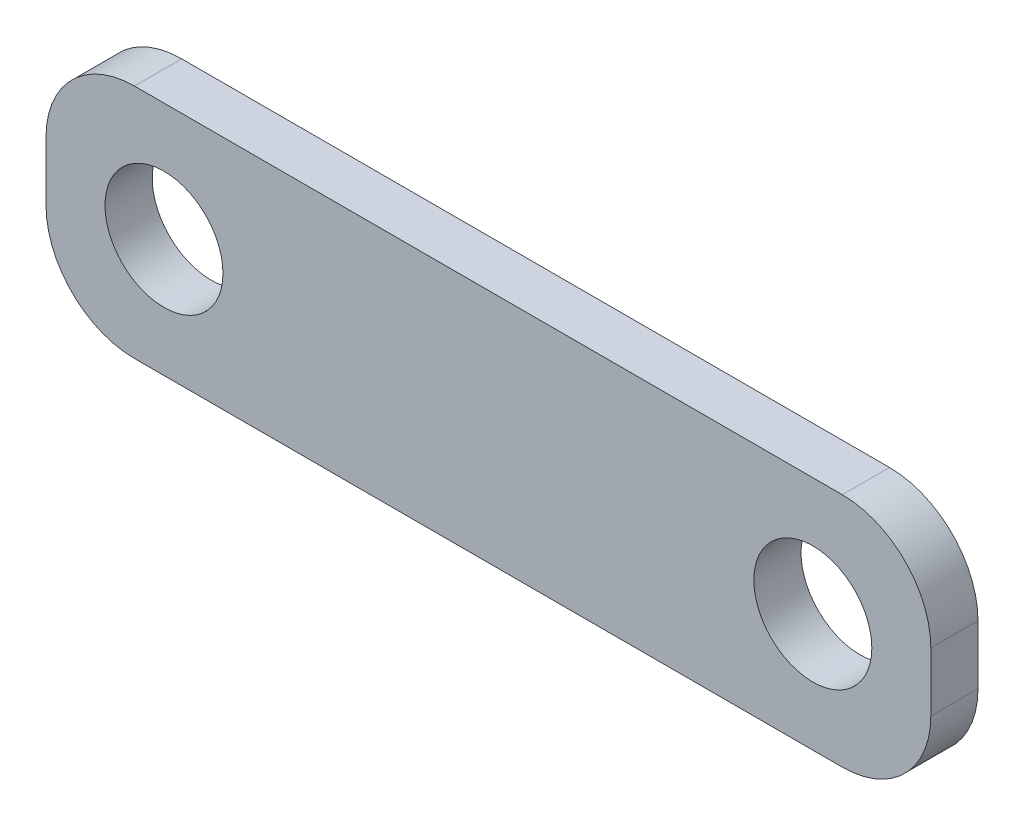
ISO-10303-21;
HEADER;
FILE_DESCRIPTION(('STEP AP214'),'2;1');
FILE_NAME('part.step','',(''),(''),'','','');
FILE_SCHEMA(('AUTOMOTIVE_DESIGN { 1 0 10303 214 1 1 1 1 }'));
ENDSEC;
DATA;
#1=APPLICATION_CONTEXT('core data for automotive mechanical design processes');
#2=APPLICATION_PROTOCOL_DEFINITION('international standard','automotive_design',2000,#1);
#3=PRODUCT_CONTEXT('',#1,'mechanical');
#4=PRODUCT('Part','Part','',(#3));
#5=PRODUCT_RELATED_PRODUCT_CATEGORY('part','',(#4));
#6=PRODUCT_DEFINITION_FORMATION('','',#4);
#7=PRODUCT_DEFINITION_CONTEXT('part definition',#1,'design');
#8=PRODUCT_DEFINITION('design','',#6,#7);
#9=PRODUCT_DEFINITION_SHAPE('','',#8);
#10=(LENGTH_UNIT() NAMED_UNIT(*) SI_UNIT(.MILLI.,.METRE.));
#11=(NAMED_UNIT(*) PLANE_ANGLE_UNIT() SI_UNIT($,.RADIAN.));
#12=(NAMED_UNIT(*) SI_UNIT($,.STERADIAN.) SOLID_ANGLE_UNIT());
#13=UNCERTAINTY_MEASURE_WITH_UNIT(LENGTH_MEASURE(1.E-05),#10,'distance_accuracy_value','');
#14=(GEOMETRIC_REPRESENTATION_CONTEXT(3) GLOBAL_UNCERTAINTY_ASSIGNED_CONTEXT((#13)) GLOBAL_UNIT_ASSIGNED_CONTEXT((#10,
#11,#12)) REPRESENTATION_CONTEXT('',''));
#15=CARTESIAN_POINT('',(0.,0.,0.));
#16=DIRECTION('',(0.,0.,1.));
#17=DIRECTION('',(1.,0.,0.));
#18=AXIS2_PLACEMENT_3D('',#15,#16,#17);
#19=CARTESIAN_POINT('',(150.,0.,4.));
#20=DIRECTION('',(0.,1.,0.));
#21=DIRECTION('',(-1.,0.,0.));
#22=AXIS2_PLACEMENT_3D('',#19,#20,#21);
#23=PLANE('',#22);
#24=DIRECTION('',(1.,0.,0.));
#25=VECTOR('',#24,1.);
#26=CARTESIAN_POINT('',(150.,0.,-4.));
#27=LINE('',#26,#25);
#28=CARTESIAN_POINT('',(15.,0.,-4.));
#29=VERTEX_POINT('',#28);
#30=CARTESIAN_POINT('',(135.,0.,-4.));
#31=VERTEX_POINT('',#30);
#32=EDGE_CURVE('E135',#29,#31,#27,.T.);
#33=ORIENTED_EDGE('',*,*,#32,.T.);
#34=DIRECTION('',(0.,0.,-1.));
#35=VECTOR('',#34,1.);
#36=CARTESIAN_POINT('',(135.,0.,4.));
#37=LINE('',#36,#35);
#38=CARTESIAN_POINT('',(135.,0.,4.));
#39=VERTEX_POINT('',#38);
#40=EDGE_CURVE('E110',#31,#39,#37,.F.);
#41=ORIENTED_EDGE('',*,*,#40,.T.);
#42=DIRECTION('',(1.,0.,0.));
#43=VECTOR('',#42,1.);
#44=CARTESIAN_POINT('',(150.,0.,4.));
#45=LINE('',#44,#43);
#46=CARTESIAN_POINT('',(15.,0.,4.));
#47=VERTEX_POINT('',#46);
#48=EDGE_CURVE('E148',#47,#39,#45,.T.);
#49=ORIENTED_EDGE('',*,*,#48,.F.);
#50=DIRECTION('',(0.,0.,-1.));
#51=VECTOR('',#50,1.);
#52=CARTESIAN_POINT('',(15.,0.,4.));
#53=LINE('',#52,#51);
#54=EDGE_CURVE('E116',#47,#29,#53,.T.);
#55=ORIENTED_EDGE('',*,*,#54,.T.);
#56=EDGE_LOOP('',(#33,#41,#49,#55));
#57=FACE_BOUND('',#56,.T.);
#58=ADVANCED_FACE('F39',(#57),#23,.F.);
#59=CARTESIAN_POINT('',(150.,40.,4.));
#60=DIRECTION('',(-1.,0.,0.));
#61=DIRECTION('',(0.,0.,1.));
#62=AXIS2_PLACEMENT_3D('',#59,#60,#61);
#63=PLANE('',#62);
#64=DIRECTION('',(0.,1.,0.));
#65=VECTOR('',#64,1.);
#66=CARTESIAN_POINT('',(150.,40.,4.));
#67=LINE('',#66,#65);
#68=CARTESIAN_POINT('',(150.,15.,4.));
#69=VERTEX_POINT('',#68);
#70=CARTESIAN_POINT('',(150.,25.,4.));
#71=VERTEX_POINT('',#70);
#72=EDGE_CURVE('E126',#69,#71,#67,.T.);
#73=ORIENTED_EDGE('',*,*,#72,.F.);
#74=DIRECTION('',(0.,0.,-1.));
#75=VECTOR('',#74,1.);
#76=CARTESIAN_POINT('',(150.,15.,4.));
#77=LINE('',#76,#75);
#78=CARTESIAN_POINT('',(150.,15.,-4.));
#79=VERTEX_POINT('',#78);
#80=EDGE_CURVE('E109',#69,#79,#77,.T.);
#81=ORIENTED_EDGE('',*,*,#80,.T.);
#82=DIRECTION('',(0.,1.,0.));
#83=VECTOR('',#82,1.);
#84=CARTESIAN_POINT('',(150.,40.,-4.));
#85=LINE('',#84,#83);
#86=CARTESIAN_POINT('',(150.,25.,-4.));
#87=VERTEX_POINT('',#86);
#88=EDGE_CURVE('E123',#79,#87,#85,.T.);
#89=ORIENTED_EDGE('',*,*,#88,.T.);
#90=DIRECTION('',(0.,0.,-1.));
#91=VECTOR('',#90,1.);
#92=CARTESIAN_POINT('',(150.,25.,4.));
#93=LINE('',#92,#91);
#94=EDGE_CURVE('E129',#87,#71,#93,.F.);
#95=ORIENTED_EDGE('',*,*,#94,.T.);
#96=EDGE_LOOP('',(#73,#81,#89,#95));
#97=FACE_BOUND('',#96,.T.);
#98=ADVANCED_FACE('F122',(#97),#63,.F.);
#99=CARTESIAN_POINT('',(0.,40.,4.));
#100=DIRECTION('',(0.,-1.,0.));
#101=DIRECTION('',(0.,0.,-1.));
#102=AXIS2_PLACEMENT_3D('',#99,#100,#101);
#103=PLANE('',#102);
#104=DIRECTION('',(-1.,0.,0.));
#105=VECTOR('',#104,1.);
#106=CARTESIAN_POINT('',(0.,40.,4.));
#107=LINE('',#106,#105);
#108=CARTESIAN_POINT('',(135.,40.,4.));
#109=VERTEX_POINT('',#108);
#110=CARTESIAN_POINT('',(15.,40.,4.));
#111=VERTEX_POINT('',#110);
#112=EDGE_CURVE('E197',#109,#111,#107,.T.);
#113=ORIENTED_EDGE('',*,*,#112,.F.);
#114=DIRECTION('',(0.,0.,-1.));
#115=VECTOR('',#114,1.);
#116=CARTESIAN_POINT('',(135.,40.,4.));
#117=LINE('',#116,#115);
#118=CARTESIAN_POINT('',(135.,40.,-4.));
#119=VERTEX_POINT('',#118);
#120=EDGE_CURVE('E178',#109,#119,#117,.T.);
#121=ORIENTED_EDGE('',*,*,#120,.T.);
#122=DIRECTION('',(-1.,0.,0.));
#123=VECTOR('',#122,1.);
#124=CARTESIAN_POINT('',(0.,40.,-4.));
#125=LINE('',#124,#123);
#126=CARTESIAN_POINT('',(15.,40.,-4.));
#127=VERTEX_POINT('',#126);
#128=EDGE_CURVE('E134',#119,#127,#125,.T.);
#129=ORIENTED_EDGE('',*,*,#128,.T.);
#130=DIRECTION('',(0.,0.,-1.));
#131=VECTOR('',#130,1.);
#132=CARTESIAN_POINT('',(15.,40.,4.));
#133=LINE('',#132,#131);
#134=EDGE_CURVE('E175',#127,#111,#133,.F.);
#135=ORIENTED_EDGE('',*,*,#134,.T.);
#136=EDGE_LOOP('',(#113,#121,#129,#135));
#137=FACE_BOUND('',#136,.T.);
#138=ADVANCED_FACE('F214',(#137),#103,.F.);
#139=CARTESIAN_POINT('',(0.,0.,4.));
#140=DIRECTION('',(1.,0.,0.));
#141=DIRECTION('',(0.,0.,-1.));
#142=AXIS2_PLACEMENT_3D('',#139,#140,#141);
#143=PLANE('',#142);
#144=DIRECTION('',(0.,-1.,0.));
#145=VECTOR('',#144,1.);
#146=CARTESIAN_POINT('',(0.,0.,-4.));
#147=LINE('',#146,#145);
#148=CARTESIAN_POINT('',(0.,25.,-4.));
#149=VERTEX_POINT('',#148);
#150=CARTESIAN_POINT('',(0.,15.,-4.));
#151=VERTEX_POINT('',#150);
#152=EDGE_CURVE('E140',#149,#151,#147,.T.);
#153=ORIENTED_EDGE('',*,*,#152,.T.);
#154=DIRECTION('',(0.,0.,-1.));
#155=VECTOR('',#154,1.);
#156=CARTESIAN_POINT('',(0.,15.,4.));
#157=LINE('',#156,#155);
#158=CARTESIAN_POINT('',(0.,15.,4.));
#159=VERTEX_POINT('',#158);
#160=EDGE_CURVE('E11',#151,#159,#157,.F.);
#161=ORIENTED_EDGE('',*,*,#160,.T.);
#162=DIRECTION('',(0.,-1.,0.));
#163=VECTOR('',#162,1.);
#164=CARTESIAN_POINT('',(0.,0.,4.));
#165=LINE('',#164,#163);
#166=CARTESIAN_POINT('',(0.,25.,4.));
#167=VERTEX_POINT('',#166);
#168=EDGE_CURVE('E150',#167,#159,#165,.T.);
#169=ORIENTED_EDGE('',*,*,#168,.F.);
#170=DIRECTION('',(0.,0.,-1.));
#171=VECTOR('',#170,1.);
#172=CARTESIAN_POINT('',(0.,25.,4.));
#173=LINE('',#172,#171);
#174=EDGE_CURVE('E48',#167,#149,#173,.T.);
#175=ORIENTED_EDGE('',*,*,#174,.T.);
#176=EDGE_LOOP('',(#153,#161,#169,#175));
#177=FACE_BOUND('',#176,.T.);
#178=ADVANCED_FACE('F185',(#177),#143,.F.);
#179=CARTESIAN_POINT('',(0.,0.,4.));
#180=DIRECTION('',(0.,0.,-1.));
#181=DIRECTION('',(-1.,0.,0.));
#182=AXIS2_PLACEMENT_3D('',#179,#180,#181);
#183=PLANE('',#182);
#184=CARTESIAN_POINT('',(20.,20.,4.));
#185=DIRECTION('',(0.,0.,1.));
#186=DIRECTION('',(1.,0.,0.));
#187=AXIS2_PLACEMENT_3D('',#184,#185,#186);
#188=CIRCLE('',#187,10.);
#189=CARTESIAN_POINT('',(30.,20.,4.));
#190=VERTEX_POINT('',#189);
#191=EDGE_CURVE('E310',#190,#190,#188,.T.);
#192=ORIENTED_EDGE('',*,*,#191,.F.);
#193=EDGE_LOOP('',(#192));
#194=FACE_BOUND('',#193,.T.);
#195=CARTESIAN_POINT('',(130.,20.,4.));
#196=DIRECTION('',(0.,0.,1.));
#197=DIRECTION('',(1.,0.,0.));
#198=AXIS2_PLACEMENT_3D('',#195,#196,#197);
#199=CIRCLE('',#198,10.);
#200=CARTESIAN_POINT('',(140.,20.,4.));
#201=VERTEX_POINT('',#200);
#202=EDGE_CURVE('E314',#201,#201,#199,.T.);
#203=ORIENTED_EDGE('',*,*,#202,.F.);
#204=EDGE_LOOP('',(#203));
#205=FACE_BOUND('',#204,.T.);
#206=ORIENTED_EDGE('',*,*,#48,.T.);
#207=CARTESIAN_POINT('',(135.,15.,4.));
#208=DIRECTION('',(0.,0.,-1.));
#209=DIRECTION('',(-1.,0.,0.));
#210=AXIS2_PLACEMENT_3D('',#207,#208,#209);
#211=CIRCLE('',#210,15.);
#212=EDGE_CURVE('E172',#39,#69,#211,.F.);
#213=ORIENTED_EDGE('',*,*,#212,.T.);
#214=ORIENTED_EDGE('',*,*,#72,.T.);
#215=CARTESIAN_POINT('',(135.,25.,4.));
#216=DIRECTION('',(0.,0.,-1.));
#217=DIRECTION('',(-1.,0.,0.));
#218=AXIS2_PLACEMENT_3D('',#215,#216,#217);
#219=CIRCLE('',#218,15.);
#220=EDGE_CURVE('E169',#71,#109,#219,.F.);
#221=ORIENTED_EDGE('',*,*,#220,.T.);
#222=ORIENTED_EDGE('',*,*,#112,.T.);
#223=CARTESIAN_POINT('',(15.,25.,4.));
#224=DIRECTION('',(0.,0.,-1.));
#225=DIRECTION('',(-1.,0.,0.));
#226=AXIS2_PLACEMENT_3D('',#223,#224,#225);
#227=CIRCLE('',#226,15.);
#228=EDGE_CURVE('E60',#111,#167,#227,.F.);
#229=ORIENTED_EDGE('',*,*,#228,.T.);
#230=ORIENTED_EDGE('',*,*,#168,.T.);
#231=CARTESIAN_POINT('',(15.,15.,4.));
#232=DIRECTION('',(0.,0.,-1.));
#233=DIRECTION('',(-1.,0.,0.));
#234=AXIS2_PLACEMENT_3D('',#231,#232,#233);
#235=CIRCLE('',#234,15.);
#236=EDGE_CURVE('E166',#159,#47,#235,.F.);
#237=ORIENTED_EDGE('',*,*,#236,.T.);
#238=EDGE_LOOP('',(#206,#213,#214,#221,#222,#229,#230,#237));
#239=FACE_BOUND('',#238,.T.);
#240=ADVANCED_FACE('F204',(#194,#205,#239),#183,.F.);
#241=CARTESIAN_POINT('',(0.,0.,-4.));
#242=DIRECTION('',(0.,0.,-1.));
#243=DIRECTION('',(-1.,0.,0.));
#244=AXIS2_PLACEMENT_3D('',#241,#242,#243);
#245=PLANE('',#244);
#246=CARTESIAN_POINT('',(20.,20.,-4.));
#247=DIRECTION('',(0.,0.,1.));
#248=DIRECTION('',(1.,0.,0.));
#249=AXIS2_PLACEMENT_3D('',#246,#247,#248);
#250=CIRCLE('',#249,10.);
#251=CARTESIAN_POINT('',(30.,20.,-4.));
#252=VERTEX_POINT('',#251);
#253=EDGE_CURVE('E308',#252,#252,#250,.T.);
#254=ORIENTED_EDGE('',*,*,#253,.T.);
#255=EDGE_LOOP('',(#254));
#256=FACE_BOUND('',#255,.T.);
#257=CARTESIAN_POINT('',(130.,20.,-4.));
#258=DIRECTION('',(0.,0.,1.));
#259=DIRECTION('',(1.,0.,0.));
#260=AXIS2_PLACEMENT_3D('',#257,#258,#259);
#261=CIRCLE('',#260,10.);
#262=CARTESIAN_POINT('',(140.,20.,-4.));
#263=VERTEX_POINT('',#262);
#264=EDGE_CURVE('E142',#263,#263,#261,.T.);
#265=ORIENTED_EDGE('',*,*,#264,.T.);
#266=EDGE_LOOP('',(#265));
#267=FACE_BOUND('',#266,.T.);
#268=ORIENTED_EDGE('',*,*,#88,.F.);
#269=CARTESIAN_POINT('',(135.,15.,-4.));
#270=DIRECTION('',(0.,0.,-1.));
#271=DIRECTION('',(-1.,0.,0.));
#272=AXIS2_PLACEMENT_3D('',#269,#270,#271);
#273=CIRCLE('',#272,15.);
#274=EDGE_CURVE('E105',#79,#31,#273,.T.);
#275=ORIENTED_EDGE('',*,*,#274,.T.);
#276=ORIENTED_EDGE('',*,*,#32,.F.);
#277=CARTESIAN_POINT('',(15.,15.,-4.));
#278=DIRECTION('',(0.,0.,-1.));
#279=DIRECTION('',(-1.,0.,0.));
#280=AXIS2_PLACEMENT_3D('',#277,#278,#279);
#281=CIRCLE('',#280,15.);
#282=EDGE_CURVE('E154',#29,#151,#281,.T.);
#283=ORIENTED_EDGE('',*,*,#282,.T.);
#284=ORIENTED_EDGE('',*,*,#152,.F.);
#285=CARTESIAN_POINT('',(15.,25.,-4.));
#286=DIRECTION('',(0.,0.,-1.));
#287=DIRECTION('',(-1.,0.,0.));
#288=AXIS2_PLACEMENT_3D('',#285,#286,#287);
#289=CIRCLE('',#288,15.);
#290=EDGE_CURVE('E128',#149,#127,#289,.T.);
#291=ORIENTED_EDGE('',*,*,#290,.T.);
#292=ORIENTED_EDGE('',*,*,#128,.F.);
#293=CARTESIAN_POINT('',(135.,25.,-4.));
#294=DIRECTION('',(0.,0.,-1.));
#295=DIRECTION('',(-1.,0.,0.));
#296=AXIS2_PLACEMENT_3D('',#293,#294,#295);
#297=CIRCLE('',#296,15.);
#298=EDGE_CURVE('E117',#119,#87,#297,.T.);
#299=ORIENTED_EDGE('',*,*,#298,.T.);
#300=EDGE_LOOP('',(#268,#275,#276,#283,#284,#291,#292,#299));
#301=FACE_BOUND('',#300,.T.);
#302=ADVANCED_FACE('F131',(#256,#267,#301),#245,.T.);
#303=CARTESIAN_POINT('',(135.,15.,4.));
#304=DIRECTION('',(0.,0.,-1.));
#305=DIRECTION('',(-1.,0.,0.));
#306=AXIS2_PLACEMENT_3D('',#303,#304,#305);
#307=CYLINDRICAL_SURFACE('',#306,15.);
#308=ORIENTED_EDGE('',*,*,#212,.F.);
#309=ORIENTED_EDGE('',*,*,#40,.F.);
#310=ORIENTED_EDGE('',*,*,#274,.F.);
#311=ORIENTED_EDGE('',*,*,#80,.F.);
#312=EDGE_LOOP('',(#308,#309,#310,#311));
#313=FACE_BOUND('',#312,.T.);
#314=ADVANCED_FACE('F108',(#313),#307,.T.);
#315=CARTESIAN_POINT('',(135.,25.,4.));
#316=DIRECTION('',(0.,0.,-1.));
#317=DIRECTION('',(-1.,0.,0.));
#318=AXIS2_PLACEMENT_3D('',#315,#316,#317);
#319=CYLINDRICAL_SURFACE('',#318,15.);
#320=ORIENTED_EDGE('',*,*,#220,.F.);
#321=ORIENTED_EDGE('',*,*,#94,.F.);
#322=ORIENTED_EDGE('',*,*,#298,.F.);
#323=ORIENTED_EDGE('',*,*,#120,.F.);
#324=EDGE_LOOP('',(#320,#321,#322,#323));
#325=FACE_BOUND('',#324,.T.);
#326=ADVANCED_FACE('F229',(#325),#319,.T.);
#327=CARTESIAN_POINT('',(15.,15.,4.));
#328=DIRECTION('',(0.,0.,-1.));
#329=DIRECTION('',(-1.,0.,0.));
#330=AXIS2_PLACEMENT_3D('',#327,#328,#329);
#331=CYLINDRICAL_SURFACE('',#330,15.);
#332=ORIENTED_EDGE('',*,*,#236,.F.);
#333=ORIENTED_EDGE('',*,*,#160,.F.);
#334=ORIENTED_EDGE('',*,*,#282,.F.);
#335=ORIENTED_EDGE('',*,*,#54,.F.);
#336=EDGE_LOOP('',(#332,#333,#334,#335));
#337=FACE_BOUND('',#336,.T.);
#338=ADVANCED_FACE('F190',(#337),#331,.T.);
#339=CARTESIAN_POINT('',(15.,25.,4.));
#340=DIRECTION('',(0.,0.,-1.));
#341=DIRECTION('',(-1.,0.,0.));
#342=AXIS2_PLACEMENT_3D('',#339,#340,#341);
#343=CYLINDRICAL_SURFACE('',#342,15.);
#344=ORIENTED_EDGE('',*,*,#228,.F.);
#345=ORIENTED_EDGE('',*,*,#134,.F.);
#346=ORIENTED_EDGE('',*,*,#290,.F.);
#347=ORIENTED_EDGE('',*,*,#174,.F.);
#348=EDGE_LOOP('',(#344,#345,#346,#347));
#349=FACE_BOUND('',#348,.T.);
#350=ADVANCED_FACE('F41',(#349),#343,.T.);
#351=CARTESIAN_POINT('',(130.,20.,4.));
#352=DIRECTION('',(0.,0.,1.));
#353=DIRECTION('',(1.,0.,0.));
#354=AXIS2_PLACEMENT_3D('',#351,#352,#353);
#355=CYLINDRICAL_SURFACE('',#354,10.);
#356=ORIENTED_EDGE('',*,*,#264,.F.);
#357=EDGE_LOOP('',(#356));
#358=FACE_BOUND('',#357,.T.);
#359=ORIENTED_EDGE('',*,*,#202,.T.);
#360=EDGE_LOOP('',(#359));
#361=FACE_BOUND('',#360,.T.);
#362=ADVANCED_FACE('F236',(#358,#361),#355,.F.);
#363=CARTESIAN_POINT('',(20.,20.,4.));
#364=DIRECTION('',(0.,0.,1.));
#365=DIRECTION('',(1.,0.,0.));
#366=AXIS2_PLACEMENT_3D('',#363,#364,#365);
#367=CYLINDRICAL_SURFACE('',#366,10.);
#368=ORIENTED_EDGE('',*,*,#253,.F.);
#369=EDGE_LOOP('',(#368));
#370=FACE_BOUND('',#369,.T.);
#371=ORIENTED_EDGE('',*,*,#191,.T.);
#372=EDGE_LOOP('',(#371));
#373=FACE_BOUND('',#372,.T.);
#374=ADVANCED_FACE('F240',(#370,#373),#367,.F.);
#375=CLOSED_SHELL('',(#58,#98,#138,#178,#240,#302,#314,#326,#338,#350,#362,#374));
#376=MANIFOLD_SOLID_BREP('B2',#375);
#377=ADVANCED_BREP_SHAPE_REPRESENTATION('',(#18,#376),#14);
#378=SHAPE_DEFINITION_REPRESENTATION(#9,#377);
ENDSEC;
END-ISO-10303-21;
